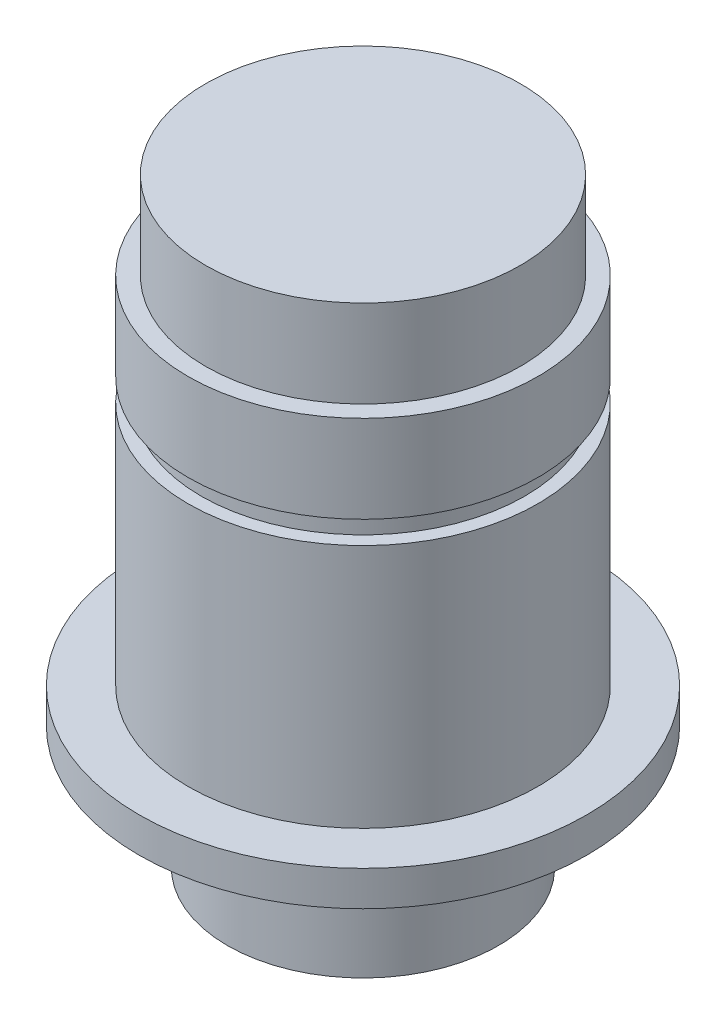
ISO-10303-21;
HEADER;
FILE_DESCRIPTION(('STEP AP214'),'2;1');
FILE_NAME('part.step','',(''),(''),'','','');
FILE_SCHEMA(('AUTOMOTIVE_DESIGN { 1 0 10303 214 1 1 1 1 }'));
ENDSEC;
DATA;
#1=APPLICATION_CONTEXT('core data for automotive mechanical design processes');
#2=APPLICATION_PROTOCOL_DEFINITION('international standard','automotive_design',2000,#1);
#3=PRODUCT_CONTEXT('',#1,'mechanical');
#4=PRODUCT('Part','Part','',(#3));
#5=PRODUCT_RELATED_PRODUCT_CATEGORY('part','',(#4));
#6=PRODUCT_DEFINITION_FORMATION('','',#4);
#7=PRODUCT_DEFINITION_CONTEXT('part definition',#1,'design');
#8=PRODUCT_DEFINITION('design','',#6,#7);
#9=PRODUCT_DEFINITION_SHAPE('','',#8);
#10=(LENGTH_UNIT() NAMED_UNIT(*) SI_UNIT(.MILLI.,.METRE.));
#11=(NAMED_UNIT(*) PLANE_ANGLE_UNIT() SI_UNIT($,.RADIAN.));
#12=(NAMED_UNIT(*) SI_UNIT($,.STERADIAN.) SOLID_ANGLE_UNIT());
#13=UNCERTAINTY_MEASURE_WITH_UNIT(LENGTH_MEASURE(1.E-05),#10,'distance_accuracy_value','');
#14=(GEOMETRIC_REPRESENTATION_CONTEXT(3) GLOBAL_UNCERTAINTY_ASSIGNED_CONTEXT((#13)) GLOBAL_UNIT_ASSIGNED_CONTEXT((#10,
#11,#12)) REPRESENTATION_CONTEXT('',''));
#15=CARTESIAN_POINT('',(0.,0.,0.));
#16=DIRECTION('',(0.,0.,1.));
#17=DIRECTION('',(1.,0.,0.));
#18=AXIS2_PLACEMENT_3D('',#15,#16,#17);
#19=CARTESIAN_POINT('',(0.,-53.5842712474619,0.));
#20=DIRECTION('',(0.,1.,0.));
#21=DIRECTION('',(0.,0.,1.));
#22=AXIS2_PLACEMENT_3D('',#19,#20,#21);
#23=CYLINDRICAL_SURFACE('',#22,10.);
#24=CARTESIAN_POINT('',(0.,-25.3,0.));
#25=DIRECTION('',(0.,1.,0.));
#26=DIRECTION('',(0.,0.,1.));
#27=AXIS2_PLACEMENT_3D('',#24,#25,#26);
#28=CIRCLE('',#27,10.);
#29=CARTESIAN_POINT('',(0.,-25.3,10.));
#30=VERTEX_POINT('',#29);
#31=EDGE_CURVE('E10',#30,#30,#28,.F.);
#32=ORIENTED_EDGE('',*,*,#31,.F.);
#33=EDGE_LOOP('',(#32));
#34=FACE_BOUND('',#33,.T.);
#35=CARTESIAN_POINT('',(0.,-11.3,0.));
#36=DIRECTION('',(0.,1.,0.));
#37=DIRECTION('',(0.,0.,1.));
#38=AXIS2_PLACEMENT_3D('',#35,#36,#37);
#39=CIRCLE('',#38,10.);
#40=CARTESIAN_POINT('',(0.,-11.3,10.));
#41=VERTEX_POINT('',#40);
#42=EDGE_CURVE('E39',#41,#41,#39,.T.);
#43=ORIENTED_EDGE('',*,*,#42,.F.);
#44=EDGE_LOOP('',(#43));
#45=FACE_BOUND('',#44,.T.);
#46=ADVANCED_FACE('F33',(#34,#45),#23,.T.);
#47=CARTESIAN_POINT('',(0.,-11.3,0.));
#48=DIRECTION('',(0.,1.,0.));
#49=DIRECTION('',(0.,0.,1.));
#50=AXIS2_PLACEMENT_3D('',#47,#48,#49);
#51=PLANE('',#50);
#52=CARTESIAN_POINT('',(0.,-11.3,0.));
#53=DIRECTION('',(0.,1.,0.));
#54=DIRECTION('',(0.,0.,1.));
#55=AXIS2_PLACEMENT_3D('',#52,#53,#54);
#56=CIRCLE('',#55,9.25);
#57=CARTESIAN_POINT('',(0.,-11.3,9.25));
#58=VERTEX_POINT('',#57);
#59=EDGE_CURVE('E55',#58,#58,#56,.T.);
#60=ORIENTED_EDGE('',*,*,#59,.F.);
#61=EDGE_LOOP('',(#60));
#62=FACE_BOUND('',#61,.T.);
#63=ORIENTED_EDGE('',*,*,#42,.T.);
#64=EDGE_LOOP('',(#63));
#65=FACE_BOUND('',#64,.T.);
#66=ADVANCED_FACE('F90',(#62,#65),#51,.T.);
#67=CARTESIAN_POINT('',(0.,-63.5038671967512,0.));
#68=DIRECTION('',(0.,1.,0.));
#69=DIRECTION('',(0.,0.,1.));
#70=AXIS2_PLACEMENT_3D('',#67,#68,#69);
#71=CYLINDRICAL_SURFACE('',#70,12.8);
#72=CARTESIAN_POINT('',(0.,-25.3,0.));
#73=DIRECTION('',(0.,-1.,0.));
#74=DIRECTION('',(0.,0.,-1.));
#75=AXIS2_PLACEMENT_3D('',#72,#73,#74);
#76=CIRCLE('',#75,12.8);
#77=CARTESIAN_POINT('',(0.,-25.3,-12.8));
#78=VERTEX_POINT('',#77);
#79=EDGE_CURVE('E47',#78,#78,#76,.T.);
#80=ORIENTED_EDGE('',*,*,#79,.T.);
#81=EDGE_LOOP('',(#80));
#82=FACE_BOUND('',#81,.T.);
#83=CARTESIAN_POINT('',(0.,-27.3,0.));
#84=DIRECTION('',(0.,-1.,0.));
#85=DIRECTION('',(0.,0.,-1.));
#86=AXIS2_PLACEMENT_3D('',#83,#84,#85);
#87=CIRCLE('',#86,12.8);
#88=CARTESIAN_POINT('',(0.,-27.3,-12.8));
#89=VERTEX_POINT('',#88);
#90=EDGE_CURVE('E43',#89,#89,#87,.T.);
#91=ORIENTED_EDGE('',*,*,#90,.F.);
#92=EDGE_LOOP('',(#91));
#93=FACE_BOUND('',#92,.T.);
#94=ADVANCED_FACE('F88',(#82,#93),#71,.T.);
#95=CARTESIAN_POINT('',(0.,-25.3,0.));
#96=DIRECTION('',(0.,-1.,0.));
#97=DIRECTION('',(0.,0.,-1.));
#98=AXIS2_PLACEMENT_3D('',#95,#96,#97);
#99=PLANE('',#98);
#100=ORIENTED_EDGE('',*,*,#31,.T.);
#101=EDGE_LOOP('',(#100));
#102=FACE_BOUND('',#101,.T.);
#103=ORIENTED_EDGE('',*,*,#79,.F.);
#104=EDGE_LOOP('',(#103));
#105=FACE_BOUND('',#104,.T.);
#106=ADVANCED_FACE('F84',(#102,#105),#99,.F.);
#107=CARTESIAN_POINT('',(0.,-27.3,0.));
#108=DIRECTION('',(0.,-1.,0.));
#109=DIRECTION('',(0.,0.,-1.));
#110=AXIS2_PLACEMENT_3D('',#107,#108,#109);
#111=PLANE('',#110);
#112=CARTESIAN_POINT('',(0.,-27.3,0.));
#113=DIRECTION('',(0.,-1.,0.));
#114=DIRECTION('',(0.,0.,-1.));
#115=AXIS2_PLACEMENT_3D('',#112,#113,#114);
#116=CIRCLE('',#115,7.75);
#117=CARTESIAN_POINT('',(0.,-27.3,-7.75));
#118=VERTEX_POINT('',#117);
#119=EDGE_CURVE('E73',#118,#118,#116,.T.);
#120=ORIENTED_EDGE('',*,*,#119,.F.);
#121=EDGE_LOOP('',(#120));
#122=FACE_BOUND('',#121,.T.);
#123=ORIENTED_EDGE('',*,*,#90,.T.);
#124=EDGE_LOOP('',(#123));
#125=FACE_BOUND('',#124,.T.);
#126=ADVANCED_FACE('F80',(#122,#125),#111,.T.);
#127=CARTESIAN_POINT('',(0.,16.1629509039023,0.));
#128=DIRECTION('',(0.,-1.,0.));
#129=DIRECTION('',(0.,0.,-1.));
#130=AXIS2_PLACEMENT_3D('',#127,#128,#129);
#131=CYLINDRICAL_SURFACE('',#130,9.25);
#132=ORIENTED_EDGE('',*,*,#59,.T.);
#133=EDGE_LOOP('',(#132));
#134=FACE_BOUND('',#133,.T.);
#135=CARTESIAN_POINT('',(0.,-10.,0.));
#136=DIRECTION('',(0.,1.,0.));
#137=DIRECTION('',(0.,0.,1.));
#138=AXIS2_PLACEMENT_3D('',#135,#136,#137);
#139=CIRCLE('',#138,9.25);
#140=CARTESIAN_POINT('',(0.,-10.,9.25));
#141=VERTEX_POINT('',#140);
#142=EDGE_CURVE('E52',#141,#141,#139,.T.);
#143=ORIENTED_EDGE('',*,*,#142,.F.);
#144=EDGE_LOOP('',(#143));
#145=FACE_BOUND('',#144,.T.);
#146=ADVANCED_FACE('F83',(#134,#145),#131,.T.);
#147=CARTESIAN_POINT('',(0.,-5.,0.));
#148=DIRECTION('',(0.,-1.,0.));
#149=DIRECTION('',(0.,0.,-1.));
#150=AXIS2_PLACEMENT_3D('',#147,#148,#149);
#151=CYLINDRICAL_SURFACE('',#150,10.);
#152=CARTESIAN_POINT('',(0.,-5.,0.));
#153=DIRECTION('',(0.,1.,0.));
#154=DIRECTION('',(0.,0.,1.));
#155=AXIS2_PLACEMENT_3D('',#152,#153,#154);
#156=CIRCLE('',#155,10.);
#157=CARTESIAN_POINT('',(0.,-5.,10.));
#158=VERTEX_POINT('',#157);
#159=EDGE_CURVE('E58',#158,#158,#156,.T.);
#160=ORIENTED_EDGE('',*,*,#159,.F.);
#161=EDGE_LOOP('',(#160));
#162=FACE_BOUND('',#161,.T.);
#163=CARTESIAN_POINT('',(0.,-10.,0.));
#164=DIRECTION('',(0.,1.,0.));
#165=DIRECTION('',(0.,0.,1.));
#166=AXIS2_PLACEMENT_3D('',#163,#164,#165);
#167=CIRCLE('',#166,10.);
#168=CARTESIAN_POINT('',(0.,-10.,10.));
#169=VERTEX_POINT('',#168);
#170=EDGE_CURVE('E59',#169,#169,#167,.T.);
#171=ORIENTED_EDGE('',*,*,#170,.T.);
#172=EDGE_LOOP('',(#171));
#173=FACE_BOUND('',#172,.T.);
#174=ADVANCED_FACE('F121',(#162,#173),#151,.T.);
#175=CARTESIAN_POINT('',(0.,-5.,0.));
#176=DIRECTION('',(0.,1.,0.));
#177=DIRECTION('',(0.,0.,1.));
#178=AXIS2_PLACEMENT_3D('',#175,#176,#177);
#179=PLANE('',#178);
#180=CARTESIAN_POINT('',(0.,-5.,0.));
#181=DIRECTION('',(0.,1.,0.));
#182=DIRECTION('',(0.,0.,1.));
#183=AXIS2_PLACEMENT_3D('',#180,#181,#182);
#184=CIRCLE('',#183,9.);
#185=CARTESIAN_POINT('',(0.,-5.,9.));
#186=VERTEX_POINT('',#185);
#187=EDGE_CURVE('E67',#186,#186,#184,.T.);
#188=ORIENTED_EDGE('',*,*,#187,.F.);
#189=EDGE_LOOP('',(#188));
#190=FACE_BOUND('',#189,.T.);
#191=ORIENTED_EDGE('',*,*,#159,.T.);
#192=EDGE_LOOP('',(#191));
#193=FACE_BOUND('',#192,.T.);
#194=ADVANCED_FACE('F132',(#190,#193),#179,.T.);
#195=CARTESIAN_POINT('',(0.,-10.,0.));
#196=DIRECTION('',(0.,1.,0.));
#197=DIRECTION('',(0.,0.,1.));
#198=AXIS2_PLACEMENT_3D('',#195,#196,#197);
#199=PLANE('',#198);
#200=ORIENTED_EDGE('',*,*,#142,.T.);
#201=EDGE_LOOP('',(#200));
#202=FACE_BOUND('',#201,.T.);
#203=ORIENTED_EDGE('',*,*,#170,.F.);
#204=EDGE_LOOP('',(#203));
#205=FACE_BOUND('',#204,.T.);
#206=ADVANCED_FACE('F140',(#202,#205),#199,.F.);
#207=CARTESIAN_POINT('',(0.,25.4558441227157,0.));
#208=DIRECTION('',(0.,-1.,0.));
#209=DIRECTION('',(0.,0.,-1.));
#210=AXIS2_PLACEMENT_3D('',#207,#208,#209);
#211=CYLINDRICAL_SURFACE('',#210,9.);
#212=ORIENTED_EDGE('',*,*,#187,.T.);
#213=EDGE_LOOP('',(#212));
#214=FACE_BOUND('',#213,.T.);
#215=CARTESIAN_POINT('',(0.,0.,0.));
#216=DIRECTION('',(0.,1.,0.));
#217=DIRECTION('',(0.,0.,1.));
#218=AXIS2_PLACEMENT_3D('',#215,#216,#217);
#219=CIRCLE('',#218,9.);
#220=CARTESIAN_POINT('',(0.,0.,9.));
#221=VERTEX_POINT('',#220);
#222=EDGE_CURVE('E62',#221,#221,#219,.T.);
#223=ORIENTED_EDGE('',*,*,#222,.F.);
#224=EDGE_LOOP('',(#223));
#225=FACE_BOUND('',#224,.T.);
#226=ADVANCED_FACE('F145',(#214,#225),#211,.T.);
#227=CARTESIAN_POINT('',(0.,0.,0.));
#228=DIRECTION('',(0.,1.,0.));
#229=DIRECTION('',(0.,0.,1.));
#230=AXIS2_PLACEMENT_3D('',#227,#228,#229);
#231=PLANE('',#230);
#232=ORIENTED_EDGE('',*,*,#222,.T.);
#233=EDGE_LOOP('',(#232));
#234=FACE_BOUND('',#233,.T.);
#235=ADVANCED_FACE('F162',(#234),#231,.T.);
#236=CARTESIAN_POINT('',(0.,-56.220310216783,0.));
#237=DIRECTION('',(0.,1.,0.));
#238=DIRECTION('',(0.,0.,1.));
#239=AXIS2_PLACEMENT_3D('',#236,#237,#238);
#240=CYLINDRICAL_SURFACE('',#239,7.75);
#241=ORIENTED_EDGE('',*,*,#119,.T.);
#242=EDGE_LOOP('',(#241));
#243=FACE_BOUND('',#242,.T.);
#244=CARTESIAN_POINT('',(0.,-34.3,0.));
#245=DIRECTION('',(0.,-1.,0.));
#246=DIRECTION('',(0.,0.,-1.));
#247=AXIS2_PLACEMENT_3D('',#244,#245,#246);
#248=CIRCLE('',#247,7.75);
#249=CARTESIAN_POINT('',(0.,-34.3,-7.75));
#250=VERTEX_POINT('',#249);
#251=EDGE_CURVE('E70',#250,#250,#248,.T.);
#252=ORIENTED_EDGE('',*,*,#251,.F.);
#253=EDGE_LOOP('',(#252));
#254=FACE_BOUND('',#253,.T.);
#255=ADVANCED_FACE('F77',(#243,#254),#240,.T.);
#256=CARTESIAN_POINT('',(0.,-34.3,0.));
#257=DIRECTION('',(0.,-1.,0.));
#258=DIRECTION('',(0.,0.,-1.));
#259=AXIS2_PLACEMENT_3D('',#256,#257,#258);
#260=PLANE('',#259);
#261=ORIENTED_EDGE('',*,*,#251,.T.);
#262=EDGE_LOOP('',(#261));
#263=FACE_BOUND('',#262,.T.);
#264=ADVANCED_FACE('F186',(#263),#260,.T.);
#265=CLOSED_SHELL('',(#46,#66,#94,#106,#126,#146,#174,#194,#206,#226,#235,#255,#264));
#266=MANIFOLD_SOLID_BREP('B2',#265);
#267=ADVANCED_BREP_SHAPE_REPRESENTATION('',(#18,#266),#14);
#268=SHAPE_DEFINITION_REPRESENTATION(#9,#267);
ENDSEC;
END-ISO-10303-21;
